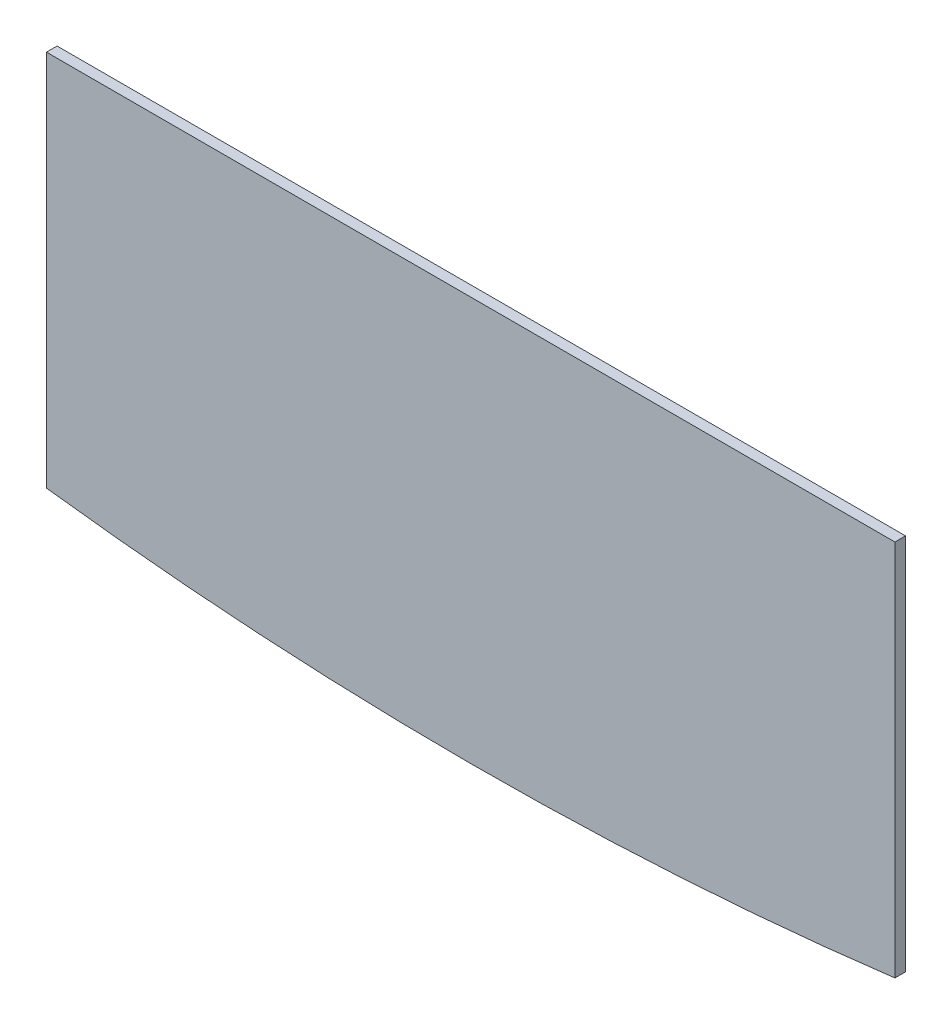
ISO-10303-21;
HEADER;
FILE_DESCRIPTION(('STEP AP214'),'2;1');
FILE_NAME('part.step','',(''),(''),'','','');
FILE_SCHEMA(('AUTOMOTIVE_DESIGN { 1 0 10303 214 1 1 1 1 }'));
ENDSEC;
DATA;
#1=APPLICATION_CONTEXT('core data for automotive mechanical design processes');
#2=APPLICATION_PROTOCOL_DEFINITION('international standard','automotive_design',2000,#1);
#3=PRODUCT_CONTEXT('',#1,'mechanical');
#4=PRODUCT('Part','Part','',(#3));
#5=PRODUCT_RELATED_PRODUCT_CATEGORY('part','',(#4));
#6=PRODUCT_DEFINITION_FORMATION('','',#4);
#7=PRODUCT_DEFINITION_CONTEXT('part definition',#1,'design');
#8=PRODUCT_DEFINITION('design','',#6,#7);
#9=PRODUCT_DEFINITION_SHAPE('','',#8);
#10=(LENGTH_UNIT() NAMED_UNIT(*) SI_UNIT(.MILLI.,.METRE.));
#11=(NAMED_UNIT(*) PLANE_ANGLE_UNIT() SI_UNIT($,.RADIAN.));
#12=(NAMED_UNIT(*) SI_UNIT($,.STERADIAN.) SOLID_ANGLE_UNIT());
#13=UNCERTAINTY_MEASURE_WITH_UNIT(LENGTH_MEASURE(1.E-05),#10,'distance_accuracy_value','');
#14=(GEOMETRIC_REPRESENTATION_CONTEXT(3) GLOBAL_UNCERTAINTY_ASSIGNED_CONTEXT((#13)) GLOBAL_UNIT_ASSIGNED_CONTEXT((#10,
#11,#12)) REPRESENTATION_CONTEXT('',''));
#15=CARTESIAN_POINT('',(0.,0.,0.));
#16=DIRECTION('',(0.,0.,1.));
#17=DIRECTION('',(1.,0.,0.));
#18=AXIS2_PLACEMENT_3D('',#15,#16,#17);
#19=CARTESIAN_POINT('',(-90.4205664671254,0.,1.));
#20=DIRECTION('',(-1.,0.,0.));
#21=DIRECTION('',(0.,0.,1.));
#22=AXIS2_PLACEMENT_3D('',#19,#20,#21);
#23=PLANE('',#22);
#24=DIRECTION('',(0.,1.,0.));
#25=VECTOR('',#24,1.);
#26=CARTESIAN_POINT('',(-90.4205664671254,0.,0.));
#27=LINE('',#26,#25);
#28=CARTESIAN_POINT('',(-90.4205664671254,-29.2673284821631,0.));
#29=VERTEX_POINT('',#28);
#30=CARTESIAN_POINT('',(-90.4205664671254,6.33267151783695,0.));
#31=VERTEX_POINT('',#30);
#32=EDGE_CURVE('E112',#29,#31,#27,.T.);
#33=ORIENTED_EDGE('',*,*,#32,.F.);
#34=DIRECTION('',(0.,0.,-1.));
#35=VECTOR('',#34,1.);
#36=CARTESIAN_POINT('',(-90.4205664671254,-29.2673284821631,1.));
#37=LINE('',#36,#35);
#38=CARTESIAN_POINT('',(-90.4205664671254,-29.2673284821631,1.));
#39=VERTEX_POINT('',#38);
#40=EDGE_CURVE('E11',#39,#29,#37,.T.);
#41=ORIENTED_EDGE('',*,*,#40,.F.);
#42=DIRECTION('',(0.,1.,0.));
#43=VECTOR('',#42,1.);
#44=CARTESIAN_POINT('',(-90.4205664671254,0.,1.));
#45=LINE('',#44,#43);
#46=CARTESIAN_POINT('',(-90.4205664671254,6.33267151783695,1.));
#47=VERTEX_POINT('',#46);
#48=EDGE_CURVE('E96',#39,#47,#45,.T.);
#49=ORIENTED_EDGE('',*,*,#48,.T.);
#50=DIRECTION('',(0.,0.,-1.));
#51=VECTOR('',#50,1.);
#52=CARTESIAN_POINT('',(-90.4205664671254,6.33267151783695,1.));
#53=LINE('',#52,#51);
#54=EDGE_CURVE('E85',#47,#31,#53,.T.);
#55=ORIENTED_EDGE('',*,*,#54,.T.);
#56=EDGE_LOOP('',(#33,#41,#49,#55));
#57=FACE_BOUND('',#56,.T.);
#58=ADVANCED_FACE('F45',(#57),#23,.T.);
#59=CARTESIAN_POINT('',(-50.4205664671253,289.986586920608,1.));
#60=DIRECTION('',(0.,0.,-1.));
#61=DIRECTION('',(-1.,0.,0.));
#62=AXIS2_PLACEMENT_3D('',#59,#60,#61);
#63=CYLINDRICAL_SURFACE('',#62,321.75);
#64=CARTESIAN_POINT('',(-50.4205664671253,289.986586920608,0.));
#65=DIRECTION('',(0.,0.,1.));
#66=DIRECTION('',(1.,0.,0.));
#67=AXIS2_PLACEMENT_3D('',#64,#65,#66);
#68=CIRCLE('',#67,321.75);
#69=CARTESIAN_POINT('',(-10.4205664671254,-29.2673284821631,0.));
#70=VERTEX_POINT('',#69);
#71=EDGE_CURVE('E102',#29,#70,#68,.T.);
#72=ORIENTED_EDGE('',*,*,#71,.T.);
#73=DIRECTION('',(0.,0.,-1.));
#74=VECTOR('',#73,1.);
#75=CARTESIAN_POINT('',(-10.4205664671254,-29.2673284821631,1.));
#76=LINE('',#75,#74);
#77=CARTESIAN_POINT('',(-10.4205664671254,-29.2673284821631,1.));
#78=VERTEX_POINT('',#77);
#79=EDGE_CURVE('E54',#78,#70,#76,.T.);
#80=ORIENTED_EDGE('',*,*,#79,.F.);
#81=CARTESIAN_POINT('',(-50.4205664671253,289.986586920608,1.));
#82=DIRECTION('',(0.,0.,1.));
#83=DIRECTION('',(1.,0.,0.));
#84=AXIS2_PLACEMENT_3D('',#81,#82,#83);
#85=CIRCLE('',#84,321.75);
#86=EDGE_CURVE('E91',#39,#78,#85,.T.);
#87=ORIENTED_EDGE('',*,*,#86,.F.);
#88=ORIENTED_EDGE('',*,*,#40,.T.);
#89=EDGE_LOOP('',(#72,#80,#87,#88));
#90=FACE_BOUND('',#89,.T.);
#91=ADVANCED_FACE('F100',(#90),#63,.T.);
#92=CARTESIAN_POINT('',(-10.4205664671254,0.,1.));
#93=DIRECTION('',(-1.,0.,0.));
#94=DIRECTION('',(0.,0.,1.));
#95=AXIS2_PLACEMENT_3D('',#92,#93,#94);
#96=PLANE('',#95);
#97=DIRECTION('',(0.,1.,0.));
#98=VECTOR('',#97,1.);
#99=CARTESIAN_POINT('',(-10.4205664671254,0.,0.));
#100=LINE('',#99,#98);
#101=CARTESIAN_POINT('',(-10.4205664671254,6.33267151783695,0.));
#102=VERTEX_POINT('',#101);
#103=EDGE_CURVE('E78',#70,#102,#100,.T.);
#104=ORIENTED_EDGE('',*,*,#103,.T.);
#105=DIRECTION('',(0.,0.,-1.));
#106=VECTOR('',#105,1.);
#107=CARTESIAN_POINT('',(-10.4205664671254,6.33267151783695,1.));
#108=LINE('',#107,#106);
#109=CARTESIAN_POINT('',(-10.4205664671254,6.33267151783695,1.));
#110=VERTEX_POINT('',#109);
#111=EDGE_CURVE('E104',#110,#102,#108,.T.);
#112=ORIENTED_EDGE('',*,*,#111,.F.);
#113=DIRECTION('',(0.,1.,0.));
#114=VECTOR('',#113,1.);
#115=CARTESIAN_POINT('',(-10.4205664671254,0.,1.));
#116=LINE('',#115,#114);
#117=EDGE_CURVE('E95',#78,#110,#116,.T.);
#118=ORIENTED_EDGE('',*,*,#117,.F.);
#119=ORIENTED_EDGE('',*,*,#79,.T.);
#120=EDGE_LOOP('',(#104,#112,#118,#119));
#121=FACE_BOUND('',#120,.T.);
#122=ADVANCED_FACE('F105',(#121),#96,.F.);
#123=CARTESIAN_POINT('',(0.,6.33267151783695,1.));
#124=DIRECTION('',(0.,-1.,0.));
#125=DIRECTION('',(0.,0.,-1.));
#126=AXIS2_PLACEMENT_3D('',#123,#124,#125);
#127=PLANE('',#126);
#128=DIRECTION('',(-1.,0.,0.));
#129=VECTOR('',#128,1.);
#130=CARTESIAN_POINT('',(0.,6.33267151783695,0.));
#131=LINE('',#130,#129);
#132=EDGE_CURVE('E120',#102,#31,#131,.T.);
#133=ORIENTED_EDGE('',*,*,#132,.T.);
#134=ORIENTED_EDGE('',*,*,#54,.F.);
#135=DIRECTION('',(-1.,0.,0.));
#136=VECTOR('',#135,1.);
#137=CARTESIAN_POINT('',(0.,6.33267151783695,1.));
#138=LINE('',#137,#136);
#139=EDGE_CURVE('E62',#110,#47,#138,.T.);
#140=ORIENTED_EDGE('',*,*,#139,.F.);
#141=ORIENTED_EDGE('',*,*,#111,.T.);
#142=EDGE_LOOP('',(#133,#134,#140,#141));
#143=FACE_BOUND('',#142,.T.);
#144=ADVANCED_FACE('F128',(#143),#127,.F.);
#145=CARTESIAN_POINT('',(0.,0.,1.));
#146=DIRECTION('',(0.,0.,1.));
#147=DIRECTION('',(1.,0.,0.));
#148=AXIS2_PLACEMENT_3D('',#145,#146,#147);
#149=PLANE('',#148);
#150=ORIENTED_EDGE('',*,*,#48,.F.);
#151=ORIENTED_EDGE('',*,*,#86,.T.);
#152=ORIENTED_EDGE('',*,*,#117,.T.);
#153=ORIENTED_EDGE('',*,*,#139,.T.);
#154=EDGE_LOOP('',(#150,#151,#152,#153));
#155=FACE_BOUND('',#154,.T.);
#156=ADVANCED_FACE('F93',(#155),#149,.T.);
#157=CARTESIAN_POINT('',(0.,0.,0.));
#158=DIRECTION('',(0.,0.,1.));
#159=DIRECTION('',(1.,0.,0.));
#160=AXIS2_PLACEMENT_3D('',#157,#158,#159);
#161=PLANE('',#160);
#162=ORIENTED_EDGE('',*,*,#32,.T.);
#163=ORIENTED_EDGE('',*,*,#132,.F.);
#164=ORIENTED_EDGE('',*,*,#103,.F.);
#165=ORIENTED_EDGE('',*,*,#71,.F.);
#166=EDGE_LOOP('',(#162,#163,#164,#165));
#167=FACE_BOUND('',#166,.T.);
#168=ADVANCED_FACE('F130',(#167),#161,.F.);
#169=CLOSED_SHELL('',(#58,#91,#122,#144,#156,#168));
#170=MANIFOLD_SOLID_BREP('B2',#169);
#171=ADVANCED_BREP_SHAPE_REPRESENTATION('',(#18,#170),#14);
#172=SHAPE_DEFINITION_REPRESENTATION(#9,#171);
ENDSEC;
END-ISO-10303-21;
